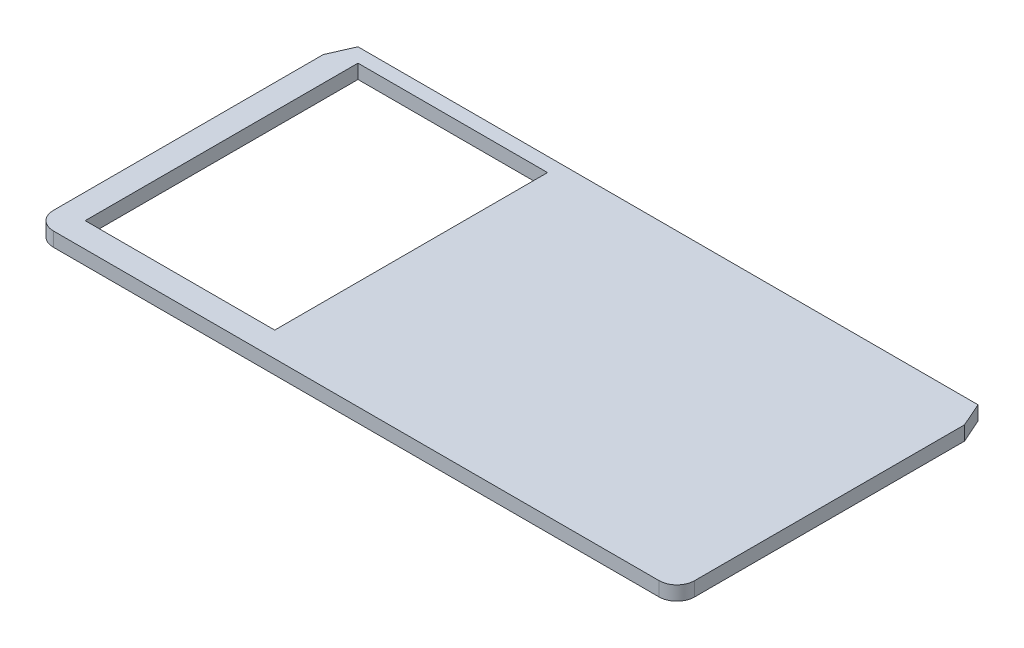
ISO-10303-21;
HEADER;
FILE_DESCRIPTION(('STEP AP214'),'2;1');
FILE_NAME('part.step','',(''),(''),'','','');
FILE_SCHEMA(('AUTOMOTIVE_DESIGN { 1 0 10303 214 1 1 1 1 }'));
ENDSEC;
DATA;
#1=APPLICATION_CONTEXT('core data for automotive mechanical design processes');
#2=APPLICATION_PROTOCOL_DEFINITION('international standard','automotive_design',2000,#1);
#3=PRODUCT_CONTEXT('',#1,'mechanical');
#4=PRODUCT('Part','Part','',(#3));
#5=PRODUCT_RELATED_PRODUCT_CATEGORY('part','',(#4));
#6=PRODUCT_DEFINITION_FORMATION('','',#4);
#7=PRODUCT_DEFINITION_CONTEXT('part definition',#1,'design');
#8=PRODUCT_DEFINITION('design','',#6,#7);
#9=PRODUCT_DEFINITION_SHAPE('','',#8);
#10=(LENGTH_UNIT() NAMED_UNIT(*) SI_UNIT(.MILLI.,.METRE.));
#11=(NAMED_UNIT(*) PLANE_ANGLE_UNIT() SI_UNIT($,.RADIAN.));
#12=(NAMED_UNIT(*) SI_UNIT($,.STERADIAN.) SOLID_ANGLE_UNIT());
#13=UNCERTAINTY_MEASURE_WITH_UNIT(LENGTH_MEASURE(1.E-05),#10,'distance_accuracy_value','');
#14=(GEOMETRIC_REPRESENTATION_CONTEXT(3) GLOBAL_UNCERTAINTY_ASSIGNED_CONTEXT((#13)) GLOBAL_UNIT_ASSIGNED_CONTEXT((#10,
#11,#12)) REPRESENTATION_CONTEXT('',''));
#15=CARTESIAN_POINT('',(0.,0.,0.));
#16=DIRECTION('',(0.,0.,1.));
#17=DIRECTION('',(1.,0.,0.));
#18=AXIS2_PLACEMENT_3D('',#15,#16,#17);
#19=CARTESIAN_POINT('',(-30.,4.,0.));
#20=DIRECTION('',(-1.,0.,0.));
#21=DIRECTION('',(0.,0.,1.));
#22=AXIS2_PLACEMENT_3D('',#19,#20,#21);
#23=PLANE('',#22);
#24=DIRECTION('',(0.,0.,-1.));
#25=VECTOR('',#24,1.);
#26=CARTESIAN_POINT('',(-30.,0.,0.));
#27=LINE('',#26,#25);
#28=CARTESIAN_POINT('',(-30.,0.,38.5));
#29=VERTEX_POINT('',#28);
#30=CARTESIAN_POINT('',(-30.,0.,-38.5));
#31=VERTEX_POINT('',#30);
#32=EDGE_CURVE('E415',#29,#31,#27,.T.);
#33=ORIENTED_EDGE('',*,*,#32,.F.);
#34=DIRECTION('',(0.,-1.,0.));
#35=VECTOR('',#34,1.);
#36=CARTESIAN_POINT('',(-30.,4.,38.5));
#37=LINE('',#36,#35);
#38=CARTESIAN_POINT('',(-30.,4.,38.5));
#39=VERTEX_POINT('',#38);
#40=EDGE_CURVE('E11',#39,#29,#37,.T.);
#41=ORIENTED_EDGE('',*,*,#40,.F.);
#42=DIRECTION('',(0.,0.,-1.));
#43=VECTOR('',#42,1.);
#44=CARTESIAN_POINT('',(-30.,4.,0.));
#45=LINE('',#44,#43);
#46=CARTESIAN_POINT('',(-30.,4.,-38.5));
#47=VERTEX_POINT('',#46);
#48=EDGE_CURVE('E373',#39,#47,#45,.T.);
#49=ORIENTED_EDGE('',*,*,#48,.T.);
#50=DIRECTION('',(0.,-1.,0.));
#51=VECTOR('',#50,1.);
#52=CARTESIAN_POINT('',(-30.,4.,-38.5));
#53=LINE('',#52,#51);
#54=EDGE_CURVE('E430',#47,#31,#53,.T.);
#55=ORIENTED_EDGE('',*,*,#54,.T.);
#56=EDGE_LOOP('',(#33,#41,#49,#55));
#57=FACE_BOUND('',#56,.T.);
#58=ADVANCED_FACE('F41',(#57),#23,.T.);
#59=CARTESIAN_POINT('',(0.,4.,38.5));
#60=DIRECTION('',(0.,0.,-1.));
#61=DIRECTION('',(-1.,0.,0.));
#62=AXIS2_PLACEMENT_3D('',#59,#60,#61);
#63=PLANE('',#62);
#64=DIRECTION('',(1.,0.,0.));
#65=VECTOR('',#64,1.);
#66=CARTESIAN_POINT('',(0.,0.,38.5));
#67=LINE('',#66,#65);
#68=CARTESIAN_POINT('',(-83.5,0.,38.5));
#69=VERTEX_POINT('',#68);
#70=EDGE_CURVE('E419',#69,#29,#67,.T.);
#71=ORIENTED_EDGE('',*,*,#70,.F.);
#72=DIRECTION('',(0.,-1.,0.));
#73=VECTOR('',#72,1.);
#74=CARTESIAN_POINT('',(-83.5,4.,38.5));
#75=LINE('',#74,#73);
#76=CARTESIAN_POINT('',(-83.5,4.,38.5));
#77=VERTEX_POINT('',#76);
#78=EDGE_CURVE('E51',#77,#69,#75,.T.);
#79=ORIENTED_EDGE('',*,*,#78,.F.);
#80=DIRECTION('',(1.,0.,0.));
#81=VECTOR('',#80,1.);
#82=CARTESIAN_POINT('',(0.,4.,38.5));
#83=LINE('',#82,#81);
#84=EDGE_CURVE('E377',#77,#39,#83,.T.);
#85=ORIENTED_EDGE('',*,*,#84,.T.);
#86=ORIENTED_EDGE('',*,*,#40,.T.);
#87=EDGE_LOOP('',(#71,#79,#85,#86));
#88=FACE_BOUND('',#87,.T.);
#89=ADVANCED_FACE('F515',(#88),#63,.T.);
#90=CARTESIAN_POINT('',(-83.5,4.,0.));
#91=DIRECTION('',(-1.,0.,0.));
#92=DIRECTION('',(0.,0.,1.));
#93=AXIS2_PLACEMENT_3D('',#90,#91,#92);
#94=PLANE('',#93);
#95=DIRECTION('',(0.,0.,-1.));
#96=VECTOR('',#95,1.);
#97=CARTESIAN_POINT('',(-83.5,0.,0.));
#98=LINE('',#97,#96);
#99=CARTESIAN_POINT('',(-83.5,0.,-38.5));
#100=VERTEX_POINT('',#99);
#101=EDGE_CURVE('E423',#69,#100,#98,.T.);
#102=ORIENTED_EDGE('',*,*,#101,.T.);
#103=DIRECTION('',(0.,-1.,0.));
#104=VECTOR('',#103,1.);
#105=CARTESIAN_POINT('',(-83.5,4.,-38.5));
#106=LINE('',#105,#104);
#107=CARTESIAN_POINT('',(-83.5,4.,-38.5));
#108=VERTEX_POINT('',#107);
#109=EDGE_CURVE('E433',#108,#100,#106,.T.);
#110=ORIENTED_EDGE('',*,*,#109,.F.);
#111=DIRECTION('',(0.,0.,-1.));
#112=VECTOR('',#111,1.);
#113=CARTESIAN_POINT('',(-83.5,4.,0.));
#114=LINE('',#113,#112);
#115=EDGE_CURVE('E381',#77,#108,#114,.T.);
#116=ORIENTED_EDGE('',*,*,#115,.F.);
#117=ORIENTED_EDGE('',*,*,#78,.T.);
#118=EDGE_LOOP('',(#102,#110,#116,#117));
#119=FACE_BOUND('',#118,.T.);
#120=ADVANCED_FACE('F521',(#119),#94,.F.);
#121=CARTESIAN_POINT('',(88.9391745112235,4.,-39.2378711078933));
#122=DIRECTION('',(-0.91491780157293,0.,0.403640206576299));
#123=DIRECTION('',(0.403640206576299,0.,0.91491780157293));
#124=AXIS2_PLACEMENT_3D('',#121,#122,#123);
#125=PLANE('',#124);
#126=DIRECTION('',(-0.403640206576299,0.,-0.91491780157293));
#127=VECTOR('',#126,1.);
#128=CARTESIAN_POINT('',(88.9391745112235,0.,-39.2378711078933));
#129=LINE('',#128,#127);
#130=CARTESIAN_POINT('',(90.5,0.,-35.7));
#131=VERTEX_POINT('',#130);
#132=CARTESIAN_POINT('',(87.5,0.,-42.5));
#133=VERTEX_POINT('',#132);
#134=EDGE_CURVE('E336',#131,#133,#129,.T.);
#135=ORIENTED_EDGE('',*,*,#134,.T.);
#136=DIRECTION('',(0.,-1.,0.));
#137=VECTOR('',#136,1.);
#138=CARTESIAN_POINT('',(87.5,4.,-42.5));
#139=LINE('',#138,#137);
#140=CARTESIAN_POINT('',(87.5,4.,-42.5));
#141=VERTEX_POINT('',#140);
#142=EDGE_CURVE('E45',#141,#133,#139,.T.);
#143=ORIENTED_EDGE('',*,*,#142,.F.);
#144=DIRECTION('',(-0.403640206576299,0.,-0.91491780157293));
#145=VECTOR('',#144,1.);
#146=CARTESIAN_POINT('',(88.9391745112235,4.,-39.2378711078933));
#147=LINE('',#146,#145);
#148=CARTESIAN_POINT('',(90.5,4.,-35.7));
#149=VERTEX_POINT('',#148);
#150=EDGE_CURVE('E346',#149,#141,#147,.T.);
#151=ORIENTED_EDGE('',*,*,#150,.F.);
#152=DIRECTION('',(0.,-1.,0.));
#153=VECTOR('',#152,1.);
#154=CARTESIAN_POINT('',(90.5,4.,-35.7));
#155=LINE('',#154,#153);
#156=EDGE_CURVE('E388',#149,#131,#155,.T.);
#157=ORIENTED_EDGE('',*,*,#156,.T.);
#158=EDGE_LOOP('',(#135,#143,#151,#157));
#159=FACE_BOUND('',#158,.T.);
#160=ADVANCED_FACE('F43',(#159),#125,.F.);
#161=CARTESIAN_POINT('',(0.,4.,-42.5));
#162=DIRECTION('',(0.,0.,-1.));
#163=DIRECTION('',(-1.,0.,0.));
#164=AXIS2_PLACEMENT_3D('',#161,#162,#163);
#165=PLANE('',#164);
#166=DIRECTION('',(1.,0.,0.));
#167=VECTOR('',#166,1.);
#168=CARTESIAN_POINT('',(0.,0.,-42.5));
#169=LINE('',#168,#167);
#170=CARTESIAN_POINT('',(-87.5,0.,-42.5));
#171=VERTEX_POINT('',#170);
#172=EDGE_CURVE('E392',#171,#133,#169,.T.);
#173=ORIENTED_EDGE('',*,*,#172,.F.);
#174=DIRECTION('',(0.,-1.,0.));
#175=VECTOR('',#174,1.);
#176=CARTESIAN_POINT('',(-87.5,4.,-42.5));
#177=LINE('',#176,#175);
#178=CARTESIAN_POINT('',(-87.5,4.,-42.5));
#179=VERTEX_POINT('',#178);
#180=EDGE_CURVE('E460',#179,#171,#177,.T.);
#181=ORIENTED_EDGE('',*,*,#180,.F.);
#182=DIRECTION('',(1.,0.,0.));
#183=VECTOR('',#182,1.);
#184=CARTESIAN_POINT('',(0.,4.,-42.5));
#185=LINE('',#184,#183);
#186=EDGE_CURVE('E349',#179,#141,#185,.T.);
#187=ORIENTED_EDGE('',*,*,#186,.T.);
#188=ORIENTED_EDGE('',*,*,#142,.T.);
#189=EDGE_LOOP('',(#173,#181,#187,#188));
#190=FACE_BOUND('',#189,.T.);
#191=ADVANCED_FACE('F468',(#190),#165,.T.);
#192=CARTESIAN_POINT('',(-88.9391745112237,4.,-39.2378711078929));
#193=DIRECTION('',(-0.914917801572932,0.,-0.403640206576294));
#194=DIRECTION('',(-0.403640206576294,0.,0.914917801572932));
#195=AXIS2_PLACEMENT_3D('',#192,#193,#194);
#196=PLANE('',#195);
#197=DIRECTION('',(0.403640206576294,0.,-0.914917801572932));
#198=VECTOR('',#197,1.);
#199=CARTESIAN_POINT('',(-88.9391745112237,0.,-39.2378711078929));
#200=LINE('',#199,#198);
#201=CARTESIAN_POINT('',(-90.5,0.,-35.7));
#202=VERTEX_POINT('',#201);
#203=EDGE_CURVE('E396',#202,#171,#200,.T.);
#204=ORIENTED_EDGE('',*,*,#203,.F.);
#205=DIRECTION('',(0.,-1.,0.));
#206=VECTOR('',#205,1.);
#207=CARTESIAN_POINT('',(-90.5,4.,-35.7));
#208=LINE('',#207,#206);
#209=CARTESIAN_POINT('',(-90.5,4.,-35.7));
#210=VERTEX_POINT('',#209);
#211=EDGE_CURVE('E458',#210,#202,#208,.T.);
#212=ORIENTED_EDGE('',*,*,#211,.F.);
#213=DIRECTION('',(0.403640206576294,0.,-0.914917801572932));
#214=VECTOR('',#213,1.);
#215=CARTESIAN_POINT('',(-88.9391745112237,4.,-39.2378711078929));
#216=LINE('',#215,#214);
#217=EDGE_CURVE('E354',#210,#179,#216,.T.);
#218=ORIENTED_EDGE('',*,*,#217,.T.);
#219=ORIENTED_EDGE('',*,*,#180,.T.);
#220=EDGE_LOOP('',(#204,#212,#218,#219));
#221=FACE_BOUND('',#220,.T.);
#222=ADVANCED_FACE('F480',(#221),#196,.T.);
#223=CARTESIAN_POINT('',(-90.5,4.,0.));
#224=DIRECTION('',(1.,0.,0.));
#225=DIRECTION('',(0.,0.,-1.));
#226=AXIS2_PLACEMENT_3D('',#223,#224,#225);
#227=PLANE('',#226);
#228=DIRECTION('',(0.,0.,1.));
#229=VECTOR('',#228,1.);
#230=CARTESIAN_POINT('',(-90.5,0.,0.));
#231=LINE('',#230,#229);
#232=CARTESIAN_POINT('',(-90.5,0.,40.5));
#233=VERTEX_POINT('',#232);
#234=EDGE_CURVE('E400',#202,#233,#231,.T.);
#235=ORIENTED_EDGE('',*,*,#234,.T.);
#236=DIRECTION('',(0.,-1.,0.));
#237=VECTOR('',#236,1.);
#238=CARTESIAN_POINT('',(-90.5,4.,40.5));
#239=LINE('',#238,#237);
#240=CARTESIAN_POINT('',(-90.5,4.,40.5));
#241=VERTEX_POINT('',#240);
#242=EDGE_CURVE('E454',#241,#233,#239,.T.);
#243=ORIENTED_EDGE('',*,*,#242,.F.);
#244=DIRECTION('',(0.,0.,1.));
#245=VECTOR('',#244,1.);
#246=CARTESIAN_POINT('',(-90.5,4.,0.));
#247=LINE('',#246,#245);
#248=EDGE_CURVE('E358',#210,#241,#247,.T.);
#249=ORIENTED_EDGE('',*,*,#248,.F.);
#250=ORIENTED_EDGE('',*,*,#211,.T.);
#251=EDGE_LOOP('',(#235,#243,#249,#250));
#252=FACE_BOUND('',#251,.T.);
#253=ADVANCED_FACE('F485',(#252),#227,.F.);
#254=CARTESIAN_POINT('',(-85.5,4.,40.5));
#255=DIRECTION('',(0.,-1.,0.));
#256=DIRECTION('',(0.,0.,-1.));
#257=AXIS2_PLACEMENT_3D('',#254,#255,#256);
#258=CYLINDRICAL_SURFACE('',#257,5.);
#259=CARTESIAN_POINT('',(-85.5,0.,40.5));
#260=DIRECTION('',(0.,1.,0.));
#261=DIRECTION('',(0.,0.,1.));
#262=AXIS2_PLACEMENT_3D('',#259,#260,#261);
#263=CIRCLE('',#262,5.);
#264=CARTESIAN_POINT('',(-85.5,0.,45.5));
#265=VERTEX_POINT('',#264);
#266=EDGE_CURVE('E403',#233,#265,#263,.T.);
#267=ORIENTED_EDGE('',*,*,#266,.T.);
#268=DIRECTION('',(0.,-1.,0.));
#269=VECTOR('',#268,1.);
#270=CARTESIAN_POINT('',(-85.5,4.,45.5));
#271=LINE('',#270,#269);
#272=CARTESIAN_POINT('',(-85.5,4.,45.5));
#273=VERTEX_POINT('',#272);
#274=EDGE_CURVE('E450',#273,#265,#271,.T.);
#275=ORIENTED_EDGE('',*,*,#274,.F.);
#276=CARTESIAN_POINT('',(-85.5,4.,40.5));
#277=DIRECTION('',(0.,1.,0.));
#278=DIRECTION('',(0.,0.,1.));
#279=AXIS2_PLACEMENT_3D('',#276,#277,#278);
#280=CIRCLE('',#279,5.);
#281=EDGE_CURVE('E361',#241,#273,#280,.T.);
#282=ORIENTED_EDGE('',*,*,#281,.F.);
#283=ORIENTED_EDGE('',*,*,#242,.T.);
#284=EDGE_LOOP('',(#267,#275,#282,#283));
#285=FACE_BOUND('',#284,.T.);
#286=ADVANCED_FACE('F505',(#285),#258,.T.);
#287=CARTESIAN_POINT('',(0.,4.,45.5));
#288=DIRECTION('',(0.,0.,-1.));
#289=DIRECTION('',(-1.,0.,0.));
#290=AXIS2_PLACEMENT_3D('',#287,#288,#289);
#291=PLANE('',#290);
#292=DIRECTION('',(1.,0.,0.));
#293=VECTOR('',#292,1.);
#294=CARTESIAN_POINT('',(0.,0.,45.5));
#295=LINE('',#294,#293);
#296=CARTESIAN_POINT('',(85.5,0.,45.5));
#297=VERTEX_POINT('',#296);
#298=EDGE_CURVE('E406',#265,#297,#295,.T.);
#299=ORIENTED_EDGE('',*,*,#298,.T.);
#300=DIRECTION('',(0.,-1.,0.));
#301=VECTOR('',#300,1.);
#302=CARTESIAN_POINT('',(85.5,4.,45.5));
#303=LINE('',#302,#301);
#304=CARTESIAN_POINT('',(85.5,4.,45.5));
#305=VERTEX_POINT('',#304);
#306=EDGE_CURVE('E446',#305,#297,#303,.T.);
#307=ORIENTED_EDGE('',*,*,#306,.F.);
#308=DIRECTION('',(1.,0.,0.));
#309=VECTOR('',#308,1.);
#310=CARTESIAN_POINT('',(0.,4.,45.5));
#311=LINE('',#310,#309);
#312=EDGE_CURVE('E364',#273,#305,#311,.T.);
#313=ORIENTED_EDGE('',*,*,#312,.F.);
#314=ORIENTED_EDGE('',*,*,#274,.T.);
#315=EDGE_LOOP('',(#299,#307,#313,#314));
#316=FACE_BOUND('',#315,.T.);
#317=ADVANCED_FACE('F502',(#316),#291,.F.);
#318=CARTESIAN_POINT('',(85.5,4.,40.5));
#319=DIRECTION('',(0.,-1.,0.));
#320=DIRECTION('',(0.,0.,-1.));
#321=AXIS2_PLACEMENT_3D('',#318,#319,#320);
#322=CYLINDRICAL_SURFACE('',#321,5.);
#323=CARTESIAN_POINT('',(85.5,0.,40.5));
#324=DIRECTION('',(0.,1.,0.));
#325=DIRECTION('',(0.,0.,1.));
#326=AXIS2_PLACEMENT_3D('',#323,#324,#325);
#327=CIRCLE('',#326,5.);
#328=CARTESIAN_POINT('',(90.5,0.,40.5));
#329=VERTEX_POINT('',#328);
#330=EDGE_CURVE('E409',#297,#329,#327,.T.);
#331=ORIENTED_EDGE('',*,*,#330,.T.);
#332=DIRECTION('',(0.,-1.,0.));
#333=VECTOR('',#332,1.);
#334=CARTESIAN_POINT('',(90.5,4.,40.5));
#335=LINE('',#334,#333);
#336=CARTESIAN_POINT('',(90.5,4.,40.5));
#337=VERTEX_POINT('',#336);
#338=EDGE_CURVE('E442',#337,#329,#335,.T.);
#339=ORIENTED_EDGE('',*,*,#338,.F.);
#340=CARTESIAN_POINT('',(85.5,4.,40.5));
#341=DIRECTION('',(0.,1.,0.));
#342=DIRECTION('',(0.,0.,1.));
#343=AXIS2_PLACEMENT_3D('',#340,#341,#342);
#344=CIRCLE('',#343,5.);
#345=EDGE_CURVE('E367',#305,#337,#344,.T.);
#346=ORIENTED_EDGE('',*,*,#345,.F.);
#347=ORIENTED_EDGE('',*,*,#306,.T.);
#348=EDGE_LOOP('',(#331,#339,#346,#347));
#349=FACE_BOUND('',#348,.T.);
#350=ADVANCED_FACE('F498',(#349),#322,.T.);
#351=CARTESIAN_POINT('',(90.5,4.,0.));
#352=DIRECTION('',(-1.,0.,0.));
#353=DIRECTION('',(0.,0.,1.));
#354=AXIS2_PLACEMENT_3D('',#351,#352,#353);
#355=PLANE('',#354);
#356=DIRECTION('',(0.,0.,-1.));
#357=VECTOR('',#356,1.);
#358=CARTESIAN_POINT('',(90.5,0.,0.));
#359=LINE('',#358,#357);
#360=EDGE_CURVE('E412',#329,#131,#359,.T.);
#361=ORIENTED_EDGE('',*,*,#360,.T.);
#362=ORIENTED_EDGE('',*,*,#156,.F.);
#363=DIRECTION('',(0.,0.,-1.));
#364=VECTOR('',#363,1.);
#365=CARTESIAN_POINT('',(90.5,4.,0.));
#366=LINE('',#365,#364);
#367=EDGE_CURVE('E370',#337,#149,#366,.T.);
#368=ORIENTED_EDGE('',*,*,#367,.F.);
#369=ORIENTED_EDGE('',*,*,#338,.T.);
#370=EDGE_LOOP('',(#361,#362,#368,#369));
#371=FACE_BOUND('',#370,.T.);
#372=ADVANCED_FACE('F494',(#371),#355,.F.);
#373=CARTESIAN_POINT('',(0.,4.,-38.5));
#374=DIRECTION('',(0.,0.,-1.));
#375=DIRECTION('',(-1.,0.,0.));
#376=AXIS2_PLACEMENT_3D('',#373,#374,#375);
#377=PLANE('',#376);
#378=DIRECTION('',(1.,0.,0.));
#379=VECTOR('',#378,1.);
#380=CARTESIAN_POINT('',(0.,0.,-38.5));
#381=LINE('',#380,#379);
#382=EDGE_CURVE('E350',#100,#31,#381,.T.);
#383=ORIENTED_EDGE('',*,*,#382,.T.);
#384=ORIENTED_EDGE('',*,*,#54,.F.);
#385=DIRECTION('',(1.,0.,0.));
#386=VECTOR('',#385,1.);
#387=CARTESIAN_POINT('',(0.,4.,-38.5));
#388=LINE('',#387,#386);
#389=EDGE_CURVE('E385',#108,#47,#388,.T.);
#390=ORIENTED_EDGE('',*,*,#389,.F.);
#391=ORIENTED_EDGE('',*,*,#109,.T.);
#392=EDGE_LOOP('',(#383,#384,#390,#391));
#393=FACE_BOUND('',#392,.T.);
#394=ADVANCED_FACE('F529',(#393),#377,.F.);
#395=CARTESIAN_POINT('',(0.,4.,0.));
#396=DIRECTION('',(0.,1.,0.));
#397=DIRECTION('',(0.,0.,1.));
#398=AXIS2_PLACEMENT_3D('',#395,#396,#397);
#399=PLANE('',#398);
#400=ORIENTED_EDGE('',*,*,#150,.T.);
#401=ORIENTED_EDGE('',*,*,#186,.F.);
#402=ORIENTED_EDGE('',*,*,#217,.F.);
#403=ORIENTED_EDGE('',*,*,#248,.T.);
#404=ORIENTED_EDGE('',*,*,#281,.T.);
#405=ORIENTED_EDGE('',*,*,#312,.T.);
#406=ORIENTED_EDGE('',*,*,#345,.T.);
#407=ORIENTED_EDGE('',*,*,#367,.T.);
#408=EDGE_LOOP('',(#400,#401,#402,#403,#404,#405,#406,#407));
#409=FACE_BOUND('',#408,.T.);
#410=ORIENTED_EDGE('',*,*,#48,.F.);
#411=ORIENTED_EDGE('',*,*,#84,.F.);
#412=ORIENTED_EDGE('',*,*,#115,.T.);
#413=ORIENTED_EDGE('',*,*,#389,.T.);
#414=EDGE_LOOP('',(#410,#411,#412,#413));
#415=FACE_BOUND('',#414,.T.);
#416=ADVANCED_FACE('F488',(#409,#415),#399,.T.);
#417=CARTESIAN_POINT('',(0.,0.,0.));
#418=DIRECTION('',(0.,1.,0.));
#419=DIRECTION('',(0.,0.,1.));
#420=AXIS2_PLACEMENT_3D('',#417,#418,#419);
#421=PLANE('',#420);
#422=DIRECTION('',(1.,0.,0.));
#423=VECTOR('',#422,1.);
#424=CARTESIAN_POINT('',(-20.,0.,10.));
#425=LINE('',#424,#423);
#426=CARTESIAN_POINT('',(-20.,0.,10.));
#427=VERTEX_POINT('',#426);
#428=CARTESIAN_POINT('',(20.,0.,10.));
#429=VERTEX_POINT('',#428);
#430=EDGE_CURVE('E328',#427,#429,#425,.T.);
#431=ORIENTED_EDGE('',*,*,#430,.T.);
#432=DIRECTION('',(0.,0.,-1.));
#433=VECTOR('',#432,1.);
#434=CARTESIAN_POINT('',(20.,0.,10.));
#435=LINE('',#434,#433);
#436=CARTESIAN_POINT('',(20.,0.,-10.));
#437=VERTEX_POINT('',#436);
#438=EDGE_CURVE('E295',#429,#437,#435,.T.);
#439=ORIENTED_EDGE('',*,*,#438,.T.);
#440=DIRECTION('',(-1.,0.,0.));
#441=VECTOR('',#440,1.);
#442=CARTESIAN_POINT('',(-20.,0.,-10.));
#443=LINE('',#442,#441);
#444=CARTESIAN_POINT('',(-20.,0.,-10.));
#445=VERTEX_POINT('',#444);
#446=EDGE_CURVE('E320',#437,#445,#443,.T.);
#447=ORIENTED_EDGE('',*,*,#446,.T.);
#448=DIRECTION('',(0.,0.,1.));
#449=VECTOR('',#448,1.);
#450=CARTESIAN_POINT('',(-20.,0.,10.));
#451=LINE('',#450,#449);
#452=EDGE_CURVE('E324',#445,#427,#451,.T.);
#453=ORIENTED_EDGE('',*,*,#452,.T.);
#454=EDGE_LOOP('',(#431,#439,#447,#453));
#455=FACE_BOUND('',#454,.T.);
#456=ORIENTED_EDGE('',*,*,#134,.F.);
#457=ORIENTED_EDGE('',*,*,#360,.F.);
#458=ORIENTED_EDGE('',*,*,#330,.F.);
#459=ORIENTED_EDGE('',*,*,#298,.F.);
#460=ORIENTED_EDGE('',*,*,#266,.F.);
#461=ORIENTED_EDGE('',*,*,#234,.F.);
#462=ORIENTED_EDGE('',*,*,#203,.T.);
#463=ORIENTED_EDGE('',*,*,#172,.T.);
#464=EDGE_LOOP('',(#456,#457,#458,#459,#460,#461,#462,#463));
#465=FACE_BOUND('',#464,.T.);
#466=ORIENTED_EDGE('',*,*,#32,.T.);
#467=ORIENTED_EDGE('',*,*,#382,.F.);
#468=ORIENTED_EDGE('',*,*,#101,.F.);
#469=ORIENTED_EDGE('',*,*,#70,.T.);
#470=EDGE_LOOP('',(#466,#467,#468,#469));
#471=FACE_BOUND('',#470,.T.);
#472=ADVANCED_FACE('F476',(#455,#465,#471),#421,.F.);
#473=CARTESIAN_POINT('',(20.,-2.,10.));
#474=DIRECTION('',(1.,0.,0.));
#475=DIRECTION('',(0.,0.,-1.));
#476=AXIS2_PLACEMENT_3D('',#473,#474,#475);
#477=PLANE('',#476);
#478=ORIENTED_EDGE('',*,*,#438,.F.);
#479=DIRECTION('',(0.,1.,0.));
#480=VECTOR('',#479,1.);
#481=CARTESIAN_POINT('',(20.,-2.,10.));
#482=LINE('',#481,#480);
#483=CARTESIAN_POINT('',(20.,-6.,10.));
#484=VERTEX_POINT('',#483);
#485=EDGE_CURVE('E333',#484,#429,#482,.T.);
#486=ORIENTED_EDGE('',*,*,#485,.F.);
#487=DIRECTION('',(0.,0.,-1.));
#488=VECTOR('',#487,1.);
#489=CARTESIAN_POINT('',(20.,-6.,0.));
#490=LINE('',#489,#488);
#491=CARTESIAN_POINT('',(20.,-6.,-10.));
#492=VERTEX_POINT('',#491);
#493=EDGE_CURVE('E260',#484,#492,#490,.T.);
#494=ORIENTED_EDGE('',*,*,#493,.T.);
#495=DIRECTION('',(0.,1.,0.));
#496=VECTOR('',#495,1.);
#497=CARTESIAN_POINT('',(20.,-2.,-10.));
#498=LINE('',#497,#496);
#499=EDGE_CURVE('E332',#492,#437,#498,.T.);
#500=ORIENTED_EDGE('',*,*,#499,.T.);
#501=EDGE_LOOP('',(#478,#486,#494,#500));
#502=FACE_BOUND('',#501,.T.);
#503=ADVANCED_FACE('F558',(#502),#477,.T.);
#504=CARTESIAN_POINT('',(-20.,-2.,10.));
#505=DIRECTION('',(0.,0.,1.));
#506=DIRECTION('',(1.,0.,0.));
#507=AXIS2_PLACEMENT_3D('',#504,#505,#506);
#508=PLANE('',#507);
#509=ORIENTED_EDGE('',*,*,#430,.F.);
#510=DIRECTION('',(0.,1.,0.));
#511=VECTOR('',#510,1.);
#512=CARTESIAN_POINT('',(-20.,-2.,10.));
#513=LINE('',#512,#511);
#514=CARTESIAN_POINT('',(-20.,-6.,10.));
#515=VERTEX_POINT('',#514);
#516=EDGE_CURVE('E337',#515,#427,#513,.T.);
#517=ORIENTED_EDGE('',*,*,#516,.F.);
#518=DIRECTION('',(1.,0.,0.));
#519=VECTOR('',#518,1.);
#520=CARTESIAN_POINT('',(0.,-6.,10.));
#521=LINE('',#520,#519);
#522=EDGE_CURVE('E256',#515,#484,#521,.T.);
#523=ORIENTED_EDGE('',*,*,#522,.T.);
#524=ORIENTED_EDGE('',*,*,#485,.T.);
#525=EDGE_LOOP('',(#509,#517,#523,#524));
#526=FACE_BOUND('',#525,.T.);
#527=ADVANCED_FACE('F566',(#526),#508,.T.);
#528=CARTESIAN_POINT('',(-20.,-2.,10.));
#529=DIRECTION('',(-1.,0.,0.));
#530=DIRECTION('',(0.,0.,1.));
#531=AXIS2_PLACEMENT_3D('',#528,#529,#530);
#532=PLANE('',#531);
#533=ORIENTED_EDGE('',*,*,#452,.F.);
#534=DIRECTION('',(0.,1.,0.));
#535=VECTOR('',#534,1.);
#536=CARTESIAN_POINT('',(-20.,-2.,-10.));
#537=LINE('',#536,#535);
#538=CARTESIAN_POINT('',(-20.,-6.,-10.));
#539=VERTEX_POINT('',#538);
#540=EDGE_CURVE('E340',#539,#445,#537,.T.);
#541=ORIENTED_EDGE('',*,*,#540,.F.);
#542=DIRECTION('',(0.,0.,-1.));
#543=VECTOR('',#542,1.);
#544=CARTESIAN_POINT('',(-20.,-6.,0.));
#545=LINE('',#544,#543);
#546=EDGE_CURVE('E215',#515,#539,#545,.T.);
#547=ORIENTED_EDGE('',*,*,#546,.F.);
#548=ORIENTED_EDGE('',*,*,#516,.T.);
#549=EDGE_LOOP('',(#533,#541,#547,#548));
#550=FACE_BOUND('',#549,.T.);
#551=ADVANCED_FACE('F574',(#550),#532,.T.);
#552=CARTESIAN_POINT('',(-20.,-2.,-10.));
#553=DIRECTION('',(0.,0.,-1.));
#554=DIRECTION('',(-1.,0.,0.));
#555=AXIS2_PLACEMENT_3D('',#552,#553,#554);
#556=PLANE('',#555);
#557=ORIENTED_EDGE('',*,*,#446,.F.);
#558=ORIENTED_EDGE('',*,*,#499,.F.);
#559=DIRECTION('',(1.,0.,0.));
#560=VECTOR('',#559,1.);
#561=CARTESIAN_POINT('',(0.,-6.,-10.));
#562=LINE('',#561,#560);
#563=EDGE_CURVE('E264',#539,#492,#562,.T.);
#564=ORIENTED_EDGE('',*,*,#563,.F.);
#565=ORIENTED_EDGE('',*,*,#540,.T.);
#566=EDGE_LOOP('',(#557,#558,#564,#565));
#567=FACE_BOUND('',#566,.T.);
#568=ADVANCED_FACE('F582',(#567),#556,.T.);
#569=CARTESIAN_POINT('',(17.5,-6.,0.));
#570=DIRECTION('',(1.,0.,0.));
#571=DIRECTION('',(0.,0.,-1.));
#572=AXIS2_PLACEMENT_3D('',#569,#570,#571);
#573=PLANE('',#572);
#574=DIRECTION('',(0.,0.,-1.));
#575=VECTOR('',#574,1.);
#576=CARTESIAN_POINT('',(17.5,-2.,0.));
#577=LINE('',#576,#575);
#578=CARTESIAN_POINT('',(17.5,-2.,2.));
#579=VERTEX_POINT('',#578);
#580=CARTESIAN_POINT('',(17.5,-2.,-2.));
#581=VERTEX_POINT('',#580);
#582=EDGE_CURVE('E271',#579,#581,#577,.T.);
#583=ORIENTED_EDGE('',*,*,#582,.T.);
#584=DIRECTION('',(0.,1.,0.));
#585=VECTOR('',#584,1.);
#586=CARTESIAN_POINT('',(17.5,-6.,-2.));
#587=LINE('',#586,#585);
#588=CARTESIAN_POINT('',(17.5,-6.,-2.));
#589=VERTEX_POINT('',#588);
#590=EDGE_CURVE('E220',#589,#581,#587,.T.);
#591=ORIENTED_EDGE('',*,*,#590,.F.);
#592=DIRECTION('',(0.,0.,-1.));
#593=VECTOR('',#592,1.);
#594=CARTESIAN_POINT('',(17.5,-6.,0.));
#595=LINE('',#594,#593);
#596=CARTESIAN_POINT('',(17.5,-6.,2.));
#597=VERTEX_POINT('',#596);
#598=EDGE_CURVE('E218',#597,#589,#595,.T.);
#599=ORIENTED_EDGE('',*,*,#598,.F.);
#600=DIRECTION('',(0.,1.,0.));
#601=VECTOR('',#600,1.);
#602=CARTESIAN_POINT('',(17.5,-6.,2.));
#603=LINE('',#602,#601);
#604=EDGE_CURVE('E204',#597,#579,#603,.T.);
#605=ORIENTED_EDGE('',*,*,#604,.T.);
#606=EDGE_LOOP('',(#583,#591,#599,#605));
#607=FACE_BOUND('',#606,.T.);
#608=ADVANCED_FACE('F219',(#607),#573,.F.);
#609=CARTESIAN_POINT('',(3.71477960242005,-6.,-8.22558340535868));
#610=DIRECTION('',(-0.411586722426498,0.,0.911370599658675));
#611=DIRECTION('',(0.911370599658675,0.,0.411586722426498));
#612=AXIS2_PLACEMENT_3D('',#609,#610,#611);
#613=PLANE('',#612);
#614=DIRECTION('',(0.911370599658675,0.,0.411586722426498));
#615=VECTOR('',#614,1.);
#616=CARTESIAN_POINT('',(3.71477960242005,-2.,-8.22558340535868));
#617=LINE('',#616,#615);
#618=CARTESIAN_POINT('',(1.99999999999999,-2.,-9.));
#619=VERTEX_POINT('',#618);
#620=EDGE_CURVE('E59',#619,#581,#617,.T.);
#621=ORIENTED_EDGE('',*,*,#620,.F.);
#622=DIRECTION('',(0.,1.,0.));
#623=VECTOR('',#622,1.);
#624=CARTESIAN_POINT('',(1.99999999999999,-6.,-9.));
#625=LINE('',#624,#623);
#626=CARTESIAN_POINT('',(1.99999999999999,-6.,-9.));
#627=VERTEX_POINT('',#626);
#628=EDGE_CURVE('E296',#627,#619,#625,.T.);
#629=ORIENTED_EDGE('',*,*,#628,.F.);
#630=DIRECTION('',(0.911370599658675,0.,0.411586722426498));
#631=VECTOR('',#630,1.);
#632=CARTESIAN_POINT('',(3.71477960242005,-6.,-8.22558340535868));
#633=LINE('',#632,#631);
#634=EDGE_CURVE('E253',#627,#589,#633,.T.);
#635=ORIENTED_EDGE('',*,*,#634,.T.);
#636=ORIENTED_EDGE('',*,*,#590,.T.);
#637=EDGE_LOOP('',(#621,#629,#635,#636));
#638=FACE_BOUND('',#637,.T.);
#639=ADVANCED_FACE('F597',(#638),#613,.T.);
#640=CARTESIAN_POINT('',(0.,-6.,-9.));
#641=DIRECTION('',(0.,0.,1.));
#642=DIRECTION('',(1.,0.,0.));
#643=AXIS2_PLACEMENT_3D('',#640,#641,#642);
#644=PLANE('',#643);
#645=DIRECTION('',(1.,0.,0.));
#646=VECTOR('',#645,1.);
#647=CARTESIAN_POINT('',(0.,-2.,-9.));
#648=LINE('',#647,#646);
#649=CARTESIAN_POINT('',(-2.00000000000001,-2.,-9.));
#650=VERTEX_POINT('',#649);
#651=EDGE_CURVE('E64',#650,#619,#648,.T.);
#652=ORIENTED_EDGE('',*,*,#651,.F.);
#653=DIRECTION('',(0.,1.,0.));
#654=VECTOR('',#653,1.);
#655=CARTESIAN_POINT('',(-2.00000000000001,-6.,-9.));
#656=LINE('',#655,#654);
#657=CARTESIAN_POINT('',(-2.00000000000001,-6.,-9.));
#658=VERTEX_POINT('',#657);
#659=EDGE_CURVE('E299',#658,#650,#656,.T.);
#660=ORIENTED_EDGE('',*,*,#659,.F.);
#661=DIRECTION('',(1.,0.,0.));
#662=VECTOR('',#661,1.);
#663=CARTESIAN_POINT('',(0.,-6.,-9.));
#664=LINE('',#663,#662);
#665=EDGE_CURVE('E249',#658,#627,#664,.T.);
#666=ORIENTED_EDGE('',*,*,#665,.T.);
#667=ORIENTED_EDGE('',*,*,#628,.T.);
#668=EDGE_LOOP('',(#652,#660,#666,#667));
#669=FACE_BOUND('',#668,.T.);
#670=ADVANCED_FACE('F604',(#669),#644,.T.);
#671=CARTESIAN_POINT('',(-3.71477960242005,-6.,-8.22558340535869));
#672=DIRECTION('',(0.411586722426498,0.,0.911370599658675));
#673=DIRECTION('',(0.911370599658675,0.,-0.411586722426498));
#674=AXIS2_PLACEMENT_3D('',#671,#672,#673);
#675=PLANE('',#674);
#676=DIRECTION('',(0.911370599658675,0.,-0.411586722426498));
#677=VECTOR('',#676,1.);
#678=CARTESIAN_POINT('',(-3.71477960242005,-2.,-8.22558340535869));
#679=LINE('',#678,#677);
#680=CARTESIAN_POINT('',(-17.5,-2.,-2.));
#681=VERTEX_POINT('',#680);
#682=EDGE_CURVE('E286',#681,#650,#679,.T.);
#683=ORIENTED_EDGE('',*,*,#682,.F.);
#684=DIRECTION('',(0.,1.,0.));
#685=VECTOR('',#684,1.);
#686=CARTESIAN_POINT('',(-17.5,-6.,-2.));
#687=LINE('',#686,#685);
#688=CARTESIAN_POINT('',(-17.5,-6.,-2.));
#689=VERTEX_POINT('',#688);
#690=EDGE_CURVE('E303',#689,#681,#687,.T.);
#691=ORIENTED_EDGE('',*,*,#690,.F.);
#692=DIRECTION('',(0.911370599658675,0.,-0.411586722426498));
#693=VECTOR('',#692,1.);
#694=CARTESIAN_POINT('',(-3.71477960242005,-6.,-8.22558340535869));
#695=LINE('',#694,#693);
#696=EDGE_CURVE('E245',#689,#658,#695,.T.);
#697=ORIENTED_EDGE('',*,*,#696,.T.);
#698=ORIENTED_EDGE('',*,*,#659,.T.);
#699=EDGE_LOOP('',(#683,#691,#697,#698));
#700=FACE_BOUND('',#699,.T.);
#701=ADVANCED_FACE('F612',(#700),#675,.T.);
#702=CARTESIAN_POINT('',(-17.5,-6.,0.));
#703=DIRECTION('',(1.,0.,0.));
#704=DIRECTION('',(0.,0.,-1.));
#705=AXIS2_PLACEMENT_3D('',#702,#703,#704);
#706=PLANE('',#705);
#707=DIRECTION('',(0.,0.,-1.));
#708=VECTOR('',#707,1.);
#709=CARTESIAN_POINT('',(-17.5,-2.,0.));
#710=LINE('',#709,#708);
#711=CARTESIAN_POINT('',(-17.5,-2.,2.));
#712=VERTEX_POINT('',#711);
#713=EDGE_CURVE('E283',#712,#681,#710,.T.);
#714=ORIENTED_EDGE('',*,*,#713,.F.);
#715=DIRECTION('',(0.,1.,0.));
#716=VECTOR('',#715,1.);
#717=CARTESIAN_POINT('',(-17.5,-6.,2.));
#718=LINE('',#717,#716);
#719=CARTESIAN_POINT('',(-17.5,-6.,2.));
#720=VERTEX_POINT('',#719);
#721=EDGE_CURVE('E307',#720,#712,#718,.T.);
#722=ORIENTED_EDGE('',*,*,#721,.F.);
#723=DIRECTION('',(0.,0.,-1.));
#724=VECTOR('',#723,1.);
#725=CARTESIAN_POINT('',(-17.5,-6.,0.));
#726=LINE('',#725,#724);
#727=EDGE_CURVE('E241',#720,#689,#726,.T.);
#728=ORIENTED_EDGE('',*,*,#727,.T.);
#729=ORIENTED_EDGE('',*,*,#690,.T.);
#730=EDGE_LOOP('',(#714,#722,#728,#729));
#731=FACE_BOUND('',#730,.T.);
#732=ADVANCED_FACE('F620',(#731),#706,.T.);
#733=CARTESIAN_POINT('',(-3.71477960242005,-6.,8.22558340535869));
#734=DIRECTION('',(0.411586722426498,0.,-0.911370599658675));
#735=DIRECTION('',(-0.911370599658675,0.,-0.411586722426498));
#736=AXIS2_PLACEMENT_3D('',#733,#734,#735);
#737=PLANE('',#736);
#738=DIRECTION('',(-0.911370599658675,0.,-0.411586722426498));
#739=VECTOR('',#738,1.);
#740=CARTESIAN_POINT('',(-3.71477960242005,-2.,8.22558340535869));
#741=LINE('',#740,#739);
#742=CARTESIAN_POINT('',(-2.00000000000001,-2.,9.));
#743=VERTEX_POINT('',#742);
#744=EDGE_CURVE('E280',#743,#712,#741,.T.);
#745=ORIENTED_EDGE('',*,*,#744,.F.);
#746=DIRECTION('',(0.,1.,0.));
#747=VECTOR('',#746,1.);
#748=CARTESIAN_POINT('',(-2.00000000000001,-6.,9.));
#749=LINE('',#748,#747);
#750=CARTESIAN_POINT('',(-2.00000000000001,-6.,9.));
#751=VERTEX_POINT('',#750);
#752=EDGE_CURVE('E311',#751,#743,#749,.T.);
#753=ORIENTED_EDGE('',*,*,#752,.F.);
#754=DIRECTION('',(-0.911370599658675,0.,-0.411586722426498));
#755=VECTOR('',#754,1.);
#756=CARTESIAN_POINT('',(-3.71477960242005,-6.,8.22558340535869));
#757=LINE('',#756,#755);
#758=EDGE_CURVE('E235',#751,#720,#757,.T.);
#759=ORIENTED_EDGE('',*,*,#758,.T.);
#760=ORIENTED_EDGE('',*,*,#721,.T.);
#761=EDGE_LOOP('',(#745,#753,#759,#760));
#762=FACE_BOUND('',#761,.T.);
#763=ADVANCED_FACE('F628',(#762),#737,.T.);
#764=CARTESIAN_POINT('',(0.,-6.,9.));
#765=DIRECTION('',(0.,0.,1.));
#766=DIRECTION('',(1.,0.,0.));
#767=AXIS2_PLACEMENT_3D('',#764,#765,#766);
#768=PLANE('',#767);
#769=DIRECTION('',(1.,0.,0.));
#770=VECTOR('',#769,1.);
#771=CARTESIAN_POINT('',(0.,-2.,9.));
#772=LINE('',#771,#770);
#773=CARTESIAN_POINT('',(1.99999999999999,-2.,9.));
#774=VERTEX_POINT('',#773);
#775=EDGE_CURVE('E276',#743,#774,#772,.T.);
#776=ORIENTED_EDGE('',*,*,#775,.T.);
#777=DIRECTION('',(0.,1.,0.));
#778=VECTOR('',#777,1.);
#779=CARTESIAN_POINT('',(1.99999999999999,-6.,9.));
#780=LINE('',#779,#778);
#781=CARTESIAN_POINT('',(1.99999999999999,-6.,9.));
#782=VERTEX_POINT('',#781);
#783=EDGE_CURVE('E214',#782,#774,#780,.T.);
#784=ORIENTED_EDGE('',*,*,#783,.F.);
#785=DIRECTION('',(1.,0.,0.));
#786=VECTOR('',#785,1.);
#787=CARTESIAN_POINT('',(0.,-6.,9.));
#788=LINE('',#787,#786);
#789=EDGE_CURVE('E230',#751,#782,#788,.T.);
#790=ORIENTED_EDGE('',*,*,#789,.F.);
#791=ORIENTED_EDGE('',*,*,#752,.T.);
#792=EDGE_LOOP('',(#776,#784,#790,#791));
#793=FACE_BOUND('',#792,.T.);
#794=ADVANCED_FACE('F636',(#793),#768,.F.);
#795=CARTESIAN_POINT('',(3.71477960242005,-6.,8.22558340535868));
#796=DIRECTION('',(-0.411586722426498,0.,-0.911370599658675));
#797=DIRECTION('',(-0.911370599658675,0.,0.411586722426498));
#798=AXIS2_PLACEMENT_3D('',#795,#796,#797);
#799=PLANE('',#798);
#800=DIRECTION('',(-0.911370599658675,0.,0.411586722426498));
#801=VECTOR('',#800,1.);
#802=CARTESIAN_POINT('',(3.71477960242005,-2.,8.22558340535868));
#803=LINE('',#802,#801);
#804=EDGE_CURVE('E210',#579,#774,#803,.T.);
#805=ORIENTED_EDGE('',*,*,#804,.F.);
#806=ORIENTED_EDGE('',*,*,#604,.F.);
#807=DIRECTION('',(-0.911370599658675,0.,0.411586722426498));
#808=VECTOR('',#807,1.);
#809=CARTESIAN_POINT('',(3.71477960242005,-6.,8.22558340535868));
#810=LINE('',#809,#808);
#811=EDGE_CURVE('E209',#597,#782,#810,.T.);
#812=ORIENTED_EDGE('',*,*,#811,.T.);
#813=ORIENTED_EDGE('',*,*,#783,.T.);
#814=EDGE_LOOP('',(#805,#806,#812,#813));
#815=FACE_BOUND('',#814,.T.);
#816=ADVANCED_FACE('F206',(#815),#799,.T.);
#817=CARTESIAN_POINT('',(0.,-6.,0.));
#818=DIRECTION('',(0.,1.,0.));
#819=DIRECTION('',(0.,0.,1.));
#820=AXIS2_PLACEMENT_3D('',#817,#818,#819);
#821=PLANE('',#820);
#822=ORIENTED_EDGE('',*,*,#598,.T.);
#823=ORIENTED_EDGE('',*,*,#634,.F.);
#824=ORIENTED_EDGE('',*,*,#665,.F.);
#825=ORIENTED_EDGE('',*,*,#696,.F.);
#826=ORIENTED_EDGE('',*,*,#727,.F.);
#827=ORIENTED_EDGE('',*,*,#758,.F.);
#828=ORIENTED_EDGE('',*,*,#789,.T.);
#829=ORIENTED_EDGE('',*,*,#811,.F.);
#830=EDGE_LOOP('',(#822,#823,#824,#825,#826,#827,#828,#829));
#831=FACE_BOUND('',#830,.T.);
#832=ORIENTED_EDGE('',*,*,#522,.F.);
#833=ORIENTED_EDGE('',*,*,#546,.T.);
#834=ORIENTED_EDGE('',*,*,#563,.T.);
#835=ORIENTED_EDGE('',*,*,#493,.F.);
#836=EDGE_LOOP('',(#832,#833,#834,#835));
#837=FACE_BOUND('',#836,.T.);
#838=ADVANCED_FACE('F226',(#831,#837),#821,.F.);
#839=CARTESIAN_POINT('',(0.,-2.,0.));
#840=DIRECTION('',(0.,-1.,0.));
#841=DIRECTION('',(0.,0.,-1.));
#842=AXIS2_PLACEMENT_3D('',#839,#840,#841);
#843=PLANE('',#842);
#844=ORIENTED_EDGE('',*,*,#620,.T.);
#845=ORIENTED_EDGE('',*,*,#582,.F.);
#846=ORIENTED_EDGE('',*,*,#804,.T.);
#847=ORIENTED_EDGE('',*,*,#775,.F.);
#848=ORIENTED_EDGE('',*,*,#744,.T.);
#849=ORIENTED_EDGE('',*,*,#713,.T.);
#850=ORIENTED_EDGE('',*,*,#682,.T.);
#851=ORIENTED_EDGE('',*,*,#651,.T.);
#852=EDGE_LOOP('',(#844,#845,#846,#847,#848,#849,#850,#851));
#853=FACE_BOUND('',#852,.T.);
#854=ADVANCED_FACE('F657',(#853),#843,.T.);
#855=CLOSED_SHELL('',(#58,#89,#120,#160,#191,#222,#253,#286,#317,#350,#372,#394,#416,#472,#503,
#527,#551,#568,#608,#639,#670,#701,#732,#763,#794,#816,#838,#854));
#856=MANIFOLD_SOLID_BREP('B2',#855);
#857=ADVANCED_BREP_SHAPE_REPRESENTATION('',(#18,#856),#14);
#858=SHAPE_DEFINITION_REPRESENTATION(#9,#857);
ENDSEC;
END-ISO-10303-21;
